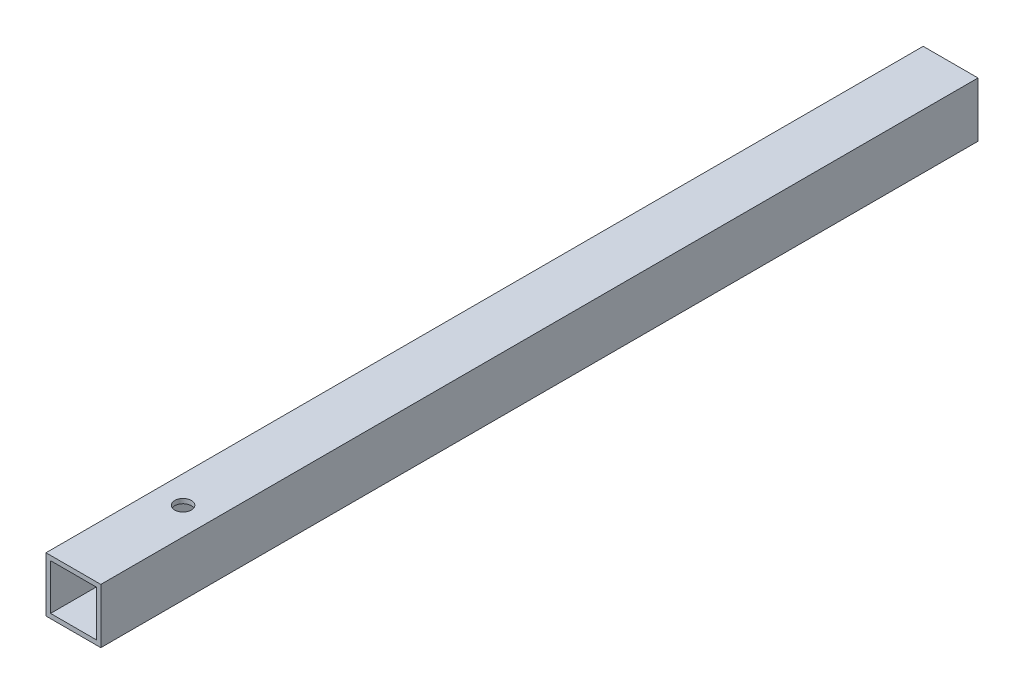
ISO-10303-21;
HEADER;
FILE_DESCRIPTION(('STEP AP214'),'2;1');
FILE_NAME('part.step','',(''),(''),'','','');
FILE_SCHEMA(('AUTOMOTIVE_DESIGN { 1 0 10303 214 1 1 1 1 }'));
ENDSEC;
DATA;
#1=APPLICATION_CONTEXT('core data for automotive mechanical design processes');
#2=APPLICATION_PROTOCOL_DEFINITION('international standard','automotive_design',2000,#1);
#3=PRODUCT_CONTEXT('',#1,'mechanical');
#4=PRODUCT('Part','Part','',(#3));
#5=PRODUCT_RELATED_PRODUCT_CATEGORY('part','',(#4));
#6=PRODUCT_DEFINITION_FORMATION('','',#4);
#7=PRODUCT_DEFINITION_CONTEXT('part definition',#1,'design');
#8=PRODUCT_DEFINITION('design','',#6,#7);
#9=PRODUCT_DEFINITION_SHAPE('','',#8);
#10=(LENGTH_UNIT() NAMED_UNIT(*) SI_UNIT(.MILLI.,.METRE.));
#11=(NAMED_UNIT(*) PLANE_ANGLE_UNIT() SI_UNIT($,.RADIAN.));
#12=(NAMED_UNIT(*) SI_UNIT($,.STERADIAN.) SOLID_ANGLE_UNIT());
#13=UNCERTAINTY_MEASURE_WITH_UNIT(LENGTH_MEASURE(1.E-05),#10,'distance_accuracy_value','');
#14=(GEOMETRIC_REPRESENTATION_CONTEXT(3) GLOBAL_UNCERTAINTY_ASSIGNED_CONTEXT((#13)) GLOBAL_UNIT_ASSIGNED_CONTEXT((#10,
#11,#12)) REPRESENTATION_CONTEXT('',''));
#15=CARTESIAN_POINT('',(0.,0.,0.));
#16=DIRECTION('',(0.,0.,1.));
#17=DIRECTION('',(1.,0.,0.));
#18=AXIS2_PLACEMENT_3D('',#15,#16,#17);
#19=CARTESIAN_POINT('',(0.,0.,152.4));
#20=DIRECTION('',(0.,0.,1.));
#21=DIRECTION('',(1.,0.,0.));
#22=AXIS2_PLACEMENT_3D('',#19,#20,#21);
#23=PLANE('',#22);
#24=DIRECTION('',(1.,0.,0.));
#25=VECTOR('',#24,1.);
#26=CARTESIAN_POINT('',(9.525,-9.525,152.4));
#27=LINE('',#26,#25);
#28=CARTESIAN_POINT('',(-9.525,-9.525,152.4));
#29=VERTEX_POINT('',#28);
#30=CARTESIAN_POINT('',(9.525,-9.525,152.4));
#31=VERTEX_POINT('',#30);
#32=EDGE_CURVE('E139',#29,#31,#27,.T.);
#33=ORIENTED_EDGE('',*,*,#32,.T.);
#34=DIRECTION('',(0.,1.,0.));
#35=VECTOR('',#34,1.);
#36=CARTESIAN_POINT('',(9.525,9.525,152.4));
#37=LINE('',#36,#35);
#38=CARTESIAN_POINT('',(9.525,9.525,152.4));
#39=VERTEX_POINT('',#38);
#40=EDGE_CURVE('E142',#31,#39,#37,.T.);
#41=ORIENTED_EDGE('',*,*,#40,.T.);
#42=DIRECTION('',(-1.,0.,0.));
#43=VECTOR('',#42,1.);
#44=CARTESIAN_POINT('',(9.525,9.525,152.4));
#45=LINE('',#44,#43);
#46=CARTESIAN_POINT('',(-9.525,9.525,152.4));
#47=VERTEX_POINT('',#46);
#48=EDGE_CURVE('E145',#39,#47,#45,.T.);
#49=ORIENTED_EDGE('',*,*,#48,.T.);
#50=DIRECTION('',(0.,-1.,0.));
#51=VECTOR('',#50,1.);
#52=CARTESIAN_POINT('',(-9.525,9.525,152.4));
#53=LINE('',#52,#51);
#54=EDGE_CURVE('E147',#47,#29,#53,.T.);
#55=ORIENTED_EDGE('',*,*,#54,.T.);
#56=EDGE_LOOP('',(#33,#41,#49,#55));
#57=FACE_BOUND('',#56,.T.);
#58=DIRECTION('',(0.,1.,0.));
#59=VECTOR('',#58,1.);
#60=CARTESIAN_POINT('',(7.9375,7.9375,152.4));
#61=LINE('',#60,#59);
#62=CARTESIAN_POINT('',(7.9375,-7.9375,152.4));
#63=VERTEX_POINT('',#62);
#64=CARTESIAN_POINT('',(7.9375,7.9375,152.4));
#65=VERTEX_POINT('',#64);
#66=EDGE_CURVE('E109',#63,#65,#61,.T.);
#67=ORIENTED_EDGE('',*,*,#66,.F.);
#68=DIRECTION('',(1.,0.,0.));
#69=VECTOR('',#68,1.);
#70=CARTESIAN_POINT('',(7.9375,-7.9375,152.4));
#71=LINE('',#70,#69);
#72=CARTESIAN_POINT('',(-7.9375,-7.9375,152.4));
#73=VERTEX_POINT('',#72);
#74=EDGE_CURVE('E101',#73,#63,#71,.T.);
#75=ORIENTED_EDGE('',*,*,#74,.F.);
#76=DIRECTION('',(0.,-1.,0.));
#77=VECTOR('',#76,1.);
#78=CARTESIAN_POINT('',(-7.9375,7.9375,152.4));
#79=LINE('',#78,#77);
#80=CARTESIAN_POINT('',(-7.9375,7.9375,152.4));
#81=VERTEX_POINT('',#80);
#82=EDGE_CURVE('E123',#81,#73,#79,.T.);
#83=ORIENTED_EDGE('',*,*,#82,.F.);
#84=DIRECTION('',(-1.,0.,0.));
#85=VECTOR('',#84,1.);
#86=CARTESIAN_POINT('',(7.9375,7.9375,152.4));
#87=LINE('',#86,#85);
#88=EDGE_CURVE('E121',#65,#81,#87,.T.);
#89=ORIENTED_EDGE('',*,*,#88,.F.);
#90=EDGE_LOOP('',(#67,#75,#83,#89));
#91=FACE_BOUND('',#90,.T.);
#92=ADVANCED_FACE('F35',(#57,#91),#23,.T.);
#93=CARTESIAN_POINT('',(0.,0.,-152.4));
#94=DIRECTION('',(0.,0.,1.));
#95=DIRECTION('',(1.,0.,0.));
#96=AXIS2_PLACEMENT_3D('',#93,#94,#95);
#97=PLANE('',#96);
#98=DIRECTION('',(1.,0.,0.));
#99=VECTOR('',#98,1.);
#100=CARTESIAN_POINT('',(9.525,-9.525,-152.4));
#101=LINE('',#100,#99);
#102=CARTESIAN_POINT('',(-9.525,-9.525,-152.4));
#103=VERTEX_POINT('',#102);
#104=CARTESIAN_POINT('',(9.525,-9.525,-152.4));
#105=VERTEX_POINT('',#104);
#106=EDGE_CURVE('E117',#103,#105,#101,.T.);
#107=ORIENTED_EDGE('',*,*,#106,.F.);
#108=DIRECTION('',(0.,-1.,0.));
#109=VECTOR('',#108,1.);
#110=CARTESIAN_POINT('',(-9.525,9.525,-152.4));
#111=LINE('',#110,#109);
#112=CARTESIAN_POINT('',(-9.525,9.525,-152.4));
#113=VERTEX_POINT('',#112);
#114=EDGE_CURVE('E143',#113,#103,#111,.T.);
#115=ORIENTED_EDGE('',*,*,#114,.F.);
#116=DIRECTION('',(-1.,0.,0.));
#117=VECTOR('',#116,1.);
#118=CARTESIAN_POINT('',(9.525,9.525,-152.4));
#119=LINE('',#118,#117);
#120=CARTESIAN_POINT('',(9.525,9.525,-152.4));
#121=VERTEX_POINT('',#120);
#122=EDGE_CURVE('E154',#121,#113,#119,.T.);
#123=ORIENTED_EDGE('',*,*,#122,.F.);
#124=DIRECTION('',(0.,1.,0.));
#125=VECTOR('',#124,1.);
#126=CARTESIAN_POINT('',(9.525,9.525,-152.4));
#127=LINE('',#126,#125);
#128=EDGE_CURVE('E152',#105,#121,#127,.T.);
#129=ORIENTED_EDGE('',*,*,#128,.F.);
#130=EDGE_LOOP('',(#107,#115,#123,#129));
#131=FACE_BOUND('',#130,.T.);
#132=DIRECTION('',(1.,0.,0.));
#133=VECTOR('',#132,1.);
#134=CARTESIAN_POINT('',(7.9375,-7.9375,-152.4));
#135=LINE('',#134,#133);
#136=CARTESIAN_POINT('',(-7.9375,-7.9375,-152.4));
#137=VERTEX_POINT('',#136);
#138=CARTESIAN_POINT('',(7.9375,-7.9375,-152.4));
#139=VERTEX_POINT('',#138);
#140=EDGE_CURVE('E59',#137,#139,#135,.T.);
#141=ORIENTED_EDGE('',*,*,#140,.T.);
#142=DIRECTION('',(0.,1.,0.));
#143=VECTOR('',#142,1.);
#144=CARTESIAN_POINT('',(7.9375,7.9375,-152.4));
#145=LINE('',#144,#143);
#146=CARTESIAN_POINT('',(7.9375,7.9375,-152.4));
#147=VERTEX_POINT('',#146);
#148=EDGE_CURVE('E116',#139,#147,#145,.T.);
#149=ORIENTED_EDGE('',*,*,#148,.T.);
#150=DIRECTION('',(-1.,0.,0.));
#151=VECTOR('',#150,1.);
#152=CARTESIAN_POINT('',(7.9375,7.9375,-152.4));
#153=LINE('',#152,#151);
#154=CARTESIAN_POINT('',(-7.9375,7.9375,-152.4));
#155=VERTEX_POINT('',#154);
#156=EDGE_CURVE('E131',#147,#155,#153,.T.);
#157=ORIENTED_EDGE('',*,*,#156,.T.);
#158=DIRECTION('',(0.,-1.,0.));
#159=VECTOR('',#158,1.);
#160=CARTESIAN_POINT('',(-7.9375,7.9375,-152.4));
#161=LINE('',#160,#159);
#162=EDGE_CURVE('E110',#155,#137,#161,.T.);
#163=ORIENTED_EDGE('',*,*,#162,.T.);
#164=EDGE_LOOP('',(#141,#149,#157,#163));
#165=FACE_BOUND('',#164,.T.);
#166=ADVANCED_FACE('F173',(#131,#165),#97,.F.);
#167=CARTESIAN_POINT('',(9.525,-9.525,152.4));
#168=DIRECTION('',(0.,1.,0.));
#169=DIRECTION('',(-1.,0.,0.));
#170=AXIS2_PLACEMENT_3D('',#167,#168,#169);
#171=PLANE('',#170);
#172=CARTESIAN_POINT('',(0.,-9.52500000000001,114.3));
#173=DIRECTION('',(0.,1.,0.));
#174=DIRECTION('',(-1.,0.,0.));
#175=AXIS2_PLACEMENT_3D('',#172,#173,#174);
#176=CIRCLE('',#175,2.8956);
#177=CARTESIAN_POINT('',(-2.8956,-9.52500000000001,114.3));
#178=VERTEX_POINT('',#177);
#179=EDGE_CURVE('E215',#178,#178,#176,.T.);
#180=ORIENTED_EDGE('',*,*,#179,.T.);
#181=EDGE_LOOP('',(#180));
#182=FACE_BOUND('',#181,.T.);
#183=ORIENTED_EDGE('',*,*,#106,.T.);
#184=DIRECTION('',(0.,0.,-1.));
#185=VECTOR('',#184,1.);
#186=CARTESIAN_POINT('',(9.525,-9.525,152.4));
#187=LINE('',#186,#185);
#188=EDGE_CURVE('E11',#31,#105,#187,.T.);
#189=ORIENTED_EDGE('',*,*,#188,.F.);
#190=ORIENTED_EDGE('',*,*,#32,.F.);
#191=DIRECTION('',(0.,0.,-1.));
#192=VECTOR('',#191,1.);
#193=CARTESIAN_POINT('',(-9.525,-9.525,152.4));
#194=LINE('',#193,#192);
#195=EDGE_CURVE('E149',#29,#103,#194,.T.);
#196=ORIENTED_EDGE('',*,*,#195,.T.);
#197=EDGE_LOOP('',(#183,#189,#190,#196));
#198=FACE_BOUND('',#197,.T.);
#199=ADVANCED_FACE('F37',(#182,#198),#171,.F.);
#200=CARTESIAN_POINT('',(9.525,9.525,152.4));
#201=DIRECTION('',(-1.,0.,0.));
#202=DIRECTION('',(0.,0.,1.));
#203=AXIS2_PLACEMENT_3D('',#200,#201,#202);
#204=PLANE('',#203);
#205=ORIENTED_EDGE('',*,*,#128,.T.);
#206=DIRECTION('',(0.,0.,-1.));
#207=VECTOR('',#206,1.);
#208=CARTESIAN_POINT('',(9.525,9.525,152.4));
#209=LINE('',#208,#207);
#210=EDGE_CURVE('E44',#39,#121,#209,.T.);
#211=ORIENTED_EDGE('',*,*,#210,.F.);
#212=ORIENTED_EDGE('',*,*,#40,.F.);
#213=ORIENTED_EDGE('',*,*,#188,.T.);
#214=EDGE_LOOP('',(#205,#211,#212,#213));
#215=FACE_BOUND('',#214,.T.);
#216=ADVANCED_FACE('F183',(#215),#204,.F.);
#217=CARTESIAN_POINT('',(9.525,9.525,152.4));
#218=DIRECTION('',(0.,-1.,0.));
#219=DIRECTION('',(1.,0.,0.));
#220=AXIS2_PLACEMENT_3D('',#217,#218,#219);
#221=PLANE('',#220);
#222=CARTESIAN_POINT('',(0.,9.525,114.3));
#223=DIRECTION('',(0.,1.,0.));
#224=DIRECTION('',(-1.,0.,0.));
#225=AXIS2_PLACEMENT_3D('',#222,#223,#224);
#226=CIRCLE('',#225,2.8956);
#227=CARTESIAN_POINT('',(-2.8956,9.525,114.3));
#228=VERTEX_POINT('',#227);
#229=EDGE_CURVE('E211',#228,#228,#226,.T.);
#230=ORIENTED_EDGE('',*,*,#229,.F.);
#231=EDGE_LOOP('',(#230));
#232=FACE_BOUND('',#231,.T.);
#233=ORIENTED_EDGE('',*,*,#122,.T.);
#234=DIRECTION('',(0.,0.,-1.));
#235=VECTOR('',#234,1.);
#236=CARTESIAN_POINT('',(-9.525,9.525,152.4));
#237=LINE('',#236,#235);
#238=EDGE_CURVE('E159',#47,#113,#237,.T.);
#239=ORIENTED_EDGE('',*,*,#238,.F.);
#240=ORIENTED_EDGE('',*,*,#48,.F.);
#241=ORIENTED_EDGE('',*,*,#210,.T.);
#242=EDGE_LOOP('',(#233,#239,#240,#241));
#243=FACE_BOUND('',#242,.T.);
#244=ADVANCED_FACE('F167',(#232,#243),#221,.F.);
#245=CARTESIAN_POINT('',(-9.525,9.525,152.4));
#246=DIRECTION('',(1.,0.,0.));
#247=DIRECTION('',(0.,0.,-1.));
#248=AXIS2_PLACEMENT_3D('',#245,#246,#247);
#249=PLANE('',#248);
#250=CARTESIAN_POINT('',(-9.525,0.,-25.4));
#251=DIRECTION('',(-1.,0.,0.));
#252=DIRECTION('',(0.,0.,1.));
#253=AXIS2_PLACEMENT_3D('',#250,#251,#252);
#254=CIRCLE('',#253,2.4257);
#255=CARTESIAN_POINT('',(-9.525,0.,-22.9743));
#256=VERTEX_POINT('',#255);
#257=EDGE_CURVE('E209',#256,#256,#254,.T.);
#258=ORIENTED_EDGE('',*,*,#257,.F.);
#259=EDGE_LOOP('',(#258));
#260=FACE_BOUND('',#259,.T.);
#261=ORIENTED_EDGE('',*,*,#114,.T.);
#262=ORIENTED_EDGE('',*,*,#195,.F.);
#263=ORIENTED_EDGE('',*,*,#54,.F.);
#264=ORIENTED_EDGE('',*,*,#238,.T.);
#265=EDGE_LOOP('',(#261,#262,#263,#264));
#266=FACE_BOUND('',#265,.T.);
#267=ADVANCED_FACE('F177',(#260,#266),#249,.F.);
#268=CARTESIAN_POINT('',(7.9375,-7.9375,152.4));
#269=DIRECTION('',(0.,1.,0.));
#270=DIRECTION('',(-1.,0.,0.));
#271=AXIS2_PLACEMENT_3D('',#268,#269,#270);
#272=PLANE('',#271);
#273=CARTESIAN_POINT('',(0.,-7.9375,114.3));
#274=DIRECTION('',(0.,1.,0.));
#275=DIRECTION('',(-1.,0.,0.));
#276=AXIS2_PLACEMENT_3D('',#273,#274,#275);
#277=CIRCLE('',#276,2.8956);
#278=CARTESIAN_POINT('',(-2.8956,-7.9375,114.3));
#279=VERTEX_POINT('',#278);
#280=EDGE_CURVE('E129',#279,#279,#277,.T.);
#281=ORIENTED_EDGE('',*,*,#280,.F.);
#282=EDGE_LOOP('',(#281));
#283=FACE_BOUND('',#282,.T.);
#284=ORIENTED_EDGE('',*,*,#140,.F.);
#285=DIRECTION('',(0.,0.,-1.));
#286=VECTOR('',#285,1.);
#287=CARTESIAN_POINT('',(-7.9375,-7.9375,152.4));
#288=LINE('',#287,#286);
#289=EDGE_CURVE('E105',#73,#137,#288,.T.);
#290=ORIENTED_EDGE('',*,*,#289,.F.);
#291=ORIENTED_EDGE('',*,*,#74,.T.);
#292=DIRECTION('',(0.,0.,-1.));
#293=VECTOR('',#292,1.);
#294=CARTESIAN_POINT('',(7.9375,-7.9375,152.4));
#295=LINE('',#294,#293);
#296=EDGE_CURVE('E104',#63,#139,#295,.T.);
#297=ORIENTED_EDGE('',*,*,#296,.T.);
#298=EDGE_LOOP('',(#284,#290,#291,#297));
#299=FACE_BOUND('',#298,.T.);
#300=ADVANCED_FACE('F103',(#283,#299),#272,.T.);
#301=CARTESIAN_POINT('',(7.9375,7.9375,152.4));
#302=DIRECTION('',(-1.,0.,0.));
#303=DIRECTION('',(0.,0.,1.));
#304=AXIS2_PLACEMENT_3D('',#301,#302,#303);
#305=PLANE('',#304);
#306=ORIENTED_EDGE('',*,*,#148,.F.);
#307=ORIENTED_EDGE('',*,*,#296,.F.);
#308=ORIENTED_EDGE('',*,*,#66,.T.);
#309=DIRECTION('',(0.,0.,-1.));
#310=VECTOR('',#309,1.);
#311=CARTESIAN_POINT('',(7.9375,7.9375,152.4));
#312=LINE('',#311,#310);
#313=EDGE_CURVE('E118',#65,#147,#312,.T.);
#314=ORIENTED_EDGE('',*,*,#313,.T.);
#315=EDGE_LOOP('',(#306,#307,#308,#314));
#316=FACE_BOUND('',#315,.T.);
#317=ADVANCED_FACE('F113',(#316),#305,.T.);
#318=CARTESIAN_POINT('',(7.9375,7.9375,152.4));
#319=DIRECTION('',(0.,-1.,0.));
#320=DIRECTION('',(1.,0.,0.));
#321=AXIS2_PLACEMENT_3D('',#318,#319,#320);
#322=PLANE('',#321);
#323=CARTESIAN_POINT('',(0.,7.9375,114.3));
#324=DIRECTION('',(0.,-1.,0.));
#325=DIRECTION('',(1.,0.,0.));
#326=AXIS2_PLACEMENT_3D('',#323,#324,#325);
#327=CIRCLE('',#326,2.8956);
#328=CARTESIAN_POINT('',(2.8956,7.9375,114.3));
#329=VERTEX_POINT('',#328);
#330=EDGE_CURVE('E39',#329,#329,#327,.T.);
#331=ORIENTED_EDGE('',*,*,#330,.F.);
#332=EDGE_LOOP('',(#331));
#333=FACE_BOUND('',#332,.T.);
#334=ORIENTED_EDGE('',*,*,#156,.F.);
#335=ORIENTED_EDGE('',*,*,#313,.F.);
#336=ORIENTED_EDGE('',*,*,#88,.T.);
#337=DIRECTION('',(0.,0.,-1.));
#338=VECTOR('',#337,1.);
#339=CARTESIAN_POINT('',(-7.9375,7.9375,152.4));
#340=LINE('',#339,#338);
#341=EDGE_CURVE('E51',#81,#155,#340,.T.);
#342=ORIENTED_EDGE('',*,*,#341,.T.);
#343=EDGE_LOOP('',(#334,#335,#336,#342));
#344=FACE_BOUND('',#343,.T.);
#345=ADVANCED_FACE('F230',(#333,#344),#322,.T.);
#346=CARTESIAN_POINT('',(-7.9375,7.9375,152.4));
#347=DIRECTION('',(1.,0.,0.));
#348=DIRECTION('',(0.,0.,-1.));
#349=AXIS2_PLACEMENT_3D('',#346,#347,#348);
#350=PLANE('',#349);
#351=CARTESIAN_POINT('',(-7.9375,0.,-25.4));
#352=DIRECTION('',(1.,0.,0.));
#353=DIRECTION('',(0.,0.,-1.));
#354=AXIS2_PLACEMENT_3D('',#351,#352,#353);
#355=CIRCLE('',#354,2.4257);
#356=CARTESIAN_POINT('',(-7.9375,0.,-27.8257));
#357=VERTEX_POINT('',#356);
#358=EDGE_CURVE('E212',#357,#357,#355,.F.);
#359=ORIENTED_EDGE('',*,*,#358,.T.);
#360=EDGE_LOOP('',(#359));
#361=FACE_BOUND('',#360,.T.);
#362=ORIENTED_EDGE('',*,*,#162,.F.);
#363=ORIENTED_EDGE('',*,*,#341,.F.);
#364=ORIENTED_EDGE('',*,*,#82,.T.);
#365=ORIENTED_EDGE('',*,*,#289,.T.);
#366=EDGE_LOOP('',(#362,#363,#364,#365));
#367=FACE_BOUND('',#366,.T.);
#368=ADVANCED_FACE('F233',(#361,#367),#350,.T.);
#369=CARTESIAN_POINT('',(0.,-9.52500000000001,114.3));
#370=DIRECTION('',(0.,1.,0.));
#371=DIRECTION('',(-1.,0.,0.));
#372=AXIS2_PLACEMENT_3D('',#369,#370,#371);
#373=CYLINDRICAL_SURFACE('',#372,2.8956);
#374=ORIENTED_EDGE('',*,*,#330,.T.);
#375=EDGE_LOOP('',(#374));
#376=FACE_BOUND('',#375,.T.);
#377=ORIENTED_EDGE('',*,*,#229,.T.);
#378=EDGE_LOOP('',(#377));
#379=FACE_BOUND('',#378,.T.);
#380=ADVANCED_FACE('F227',(#376,#379),#373,.F.);
#381=ORIENTED_EDGE('',*,*,#280,.T.);
#382=EDGE_LOOP('',(#381));
#383=FACE_BOUND('',#382,.T.);
#384=ORIENTED_EDGE('',*,*,#179,.F.);
#385=EDGE_LOOP('',(#384));
#386=FACE_BOUND('',#385,.T.);
#387=ADVANCED_FACE('F242',(#383,#386),#373,.F.);
#388=CARTESIAN_POINT('',(9.526,0.,-25.4));
#389=DIRECTION('',(-1.,0.,0.));
#390=DIRECTION('',(0.,0.,1.));
#391=AXIS2_PLACEMENT_3D('',#388,#389,#390);
#392=CYLINDRICAL_SURFACE('',#391,2.4257);
#393=ORIENTED_EDGE('',*,*,#358,.F.);
#394=EDGE_LOOP('',(#393));
#395=FACE_BOUND('',#394,.T.);
#396=ORIENTED_EDGE('',*,*,#257,.T.);
#397=EDGE_LOOP('',(#396));
#398=FACE_BOUND('',#397,.T.);
#399=ADVANCED_FACE('F274',(#395,#398),#392,.F.);
#400=CLOSED_SHELL('',(#92,#166,#199,#216,#244,#267,#300,#317,#345,#368,#380,#387,#399));
#401=MANIFOLD_SOLID_BREP('B2',#400);
#402=ADVANCED_BREP_SHAPE_REPRESENTATION('',(#18,#401),#14);
#403=SHAPE_DEFINITION_REPRESENTATION(#9,#402);
ENDSEC;
END-ISO-10303-21;
